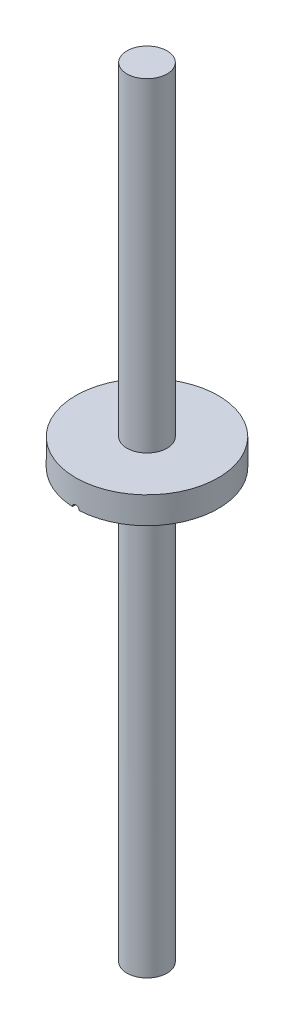
ISO-10303-21;
HEADER;
FILE_DESCRIPTION(('STEP AP214'),'2;1');
FILE_NAME('part.step','',(''),(''),'','','');
FILE_SCHEMA(('AUTOMOTIVE_DESIGN { 1 0 10303 214 1 1 1 1 }'));
ENDSEC;
DATA;
#1=APPLICATION_CONTEXT('core data for automotive mechanical design processes');
#2=APPLICATION_PROTOCOL_DEFINITION('international standard','automotive_design',2000,#1);
#3=PRODUCT_CONTEXT('',#1,'mechanical');
#4=PRODUCT('Part','Part','',(#3));
#5=PRODUCT_RELATED_PRODUCT_CATEGORY('part','',(#4));
#6=PRODUCT_DEFINITION_FORMATION('','',#4);
#7=PRODUCT_DEFINITION_CONTEXT('part definition',#1,'design');
#8=PRODUCT_DEFINITION('design','',#6,#7);
#9=PRODUCT_DEFINITION_SHAPE('','',#8);
#10=(LENGTH_UNIT() NAMED_UNIT(*) SI_UNIT(.MILLI.,.METRE.));
#11=(NAMED_UNIT(*) PLANE_ANGLE_UNIT() SI_UNIT($,.RADIAN.));
#12=(NAMED_UNIT(*) SI_UNIT($,.STERADIAN.) SOLID_ANGLE_UNIT());
#13=UNCERTAINTY_MEASURE_WITH_UNIT(LENGTH_MEASURE(1.E-05),#10,'distance_accuracy_value','');
#14=(GEOMETRIC_REPRESENTATION_CONTEXT(3) GLOBAL_UNCERTAINTY_ASSIGNED_CONTEXT((#13)) GLOBAL_UNIT_ASSIGNED_CONTEXT((#10,
#11,#12)) REPRESENTATION_CONTEXT('',''));
#15=CARTESIAN_POINT('',(0.,0.,0.));
#16=DIRECTION('',(0.,0.,1.));
#17=DIRECTION('',(1.,0.,0.));
#18=AXIS2_PLACEMENT_3D('',#15,#16,#17);
#19=CARTESIAN_POINT('',(0.,0.,-16.9291));
#20=DIRECTION('',(0.,0.,1.));
#21=DIRECTION('',(1.,0.,0.));
#22=AXIS2_PLACEMENT_3D('',#19,#20,#21);
#23=CYLINDRICAL_SURFACE('',#22,0.809435985127344);
#24=DIRECTION('',(0.,0.,1.));
#25=VECTOR('',#24,1.);
#26=CARTESIAN_POINT('',(-0.809435985127344,0.,-16.9291));
#27=LINE('',#26,#25);
#28=CARTESIAN_POINT('',(-0.809435985127344,0.,4.69320995012805));
#29=VERTEX_POINT('',#28);
#30=CARTESIAN_POINT('',(-0.809435985127344,0.,16.909738028603));
#31=VERTEX_POINT('',#30);
#32=EDGE_CURVE('E97',#29,#31,#27,.T.);
#33=ORIENTED_EDGE('',*,*,#32,.F.);
#34=CARTESIAN_POINT('',(-0.809435985127344,0.,4.69320995012805));
#35=CARTESIAN_POINT('',(-0.809476199667795,0.0451886039615407,4.69318442391153));
#36=CARTESIAN_POINT('',(-0.805654434310511,0.090358155944355,4.69386191093371));
#37=CARTESIAN_POINT('',(-0.790592699225558,0.17934834361596,4.69643201236968));
#38=CARTESIAN_POINT('',(-0.779362637061463,0.223170699183958,4.6983230037988));
#39=CARTESIAN_POINT('',(-0.749785477674711,0.30829190671508,4.70313066237056));
#40=CARTESIAN_POINT('',(-0.73143688737471,0.34959022716898,4.70604754467692));
#41=CARTESIAN_POINT('',(-0.688169649011191,0.428525277070468,4.71256924963715));
#42=CARTESIAN_POINT('',(-0.663250861195903,0.466161928608998,4.71617408692375));
#43=CARTESIAN_POINT('',(-0.607279057596034,0.537082982800621,4.72370826040872));
#44=CARTESIAN_POINT('',(-0.576172508414741,0.570324862321658,4.72764024079305));
#45=CARTESIAN_POINT('',(-0.508821194606681,0.631147201659352,4.73536211912557));
#46=CARTESIAN_POINT('',(-0.472575643115268,0.65872679290172,4.73915199520271));
#47=CARTESIAN_POINT('',(-0.395698450343435,0.707599167734623,4.7461906515197));
#48=CARTESIAN_POINT('',(-0.355041017431229,0.728851927853129,4.74943593260395));
#49=CARTESIAN_POINT('',(-0.270671123097469,0.76420894611553,4.75498984270752));
#50=CARTESIAN_POINT('',(-0.226959041827294,0.778314091984511,4.75729858803635));
#51=CARTESIAN_POINT('',(-0.138162686574374,0.798845624684551,4.76070074601862));
#52=CARTESIAN_POINT('',(-0.0930955586469425,0.80534424165717,4.76180558368754));
#53=CARTESIAN_POINT('',(-0.00249689816559721,0.810702953910278,4.76271472351319));
#54=CARTESIAN_POINT('',(0.0430346125127697,0.809563407355333,4.76251908665107));
#55=CARTESIAN_POINT('',(0.132773143179356,0.799734048602368,4.76085829886309));
#56=CARTESIAN_POINT('',(0.176988977692657,0.791122178156821,4.75940625361978));
#57=CARTESIAN_POINT('',(0.263338441302341,0.766715496367719,4.75541044268863));
#58=CARTESIAN_POINT('',(0.305472018440483,0.750920505885128,4.7528666497739));
#59=CARTESIAN_POINT('',(0.386692881165548,0.712518681408115,4.74695086459285));
#60=CARTESIAN_POINT('',(0.425764699409882,0.689879757054088,4.74357498485406));
#61=CARTESIAN_POINT('',(0.499582738294861,0.638457013360215,4.73637001081164));
#62=CARTESIAN_POINT('',(0.534328753942179,0.609672902984518,4.7325408950466));
#63=CARTESIAN_POINT('',(0.598966989685694,0.546349384519993,4.72479836996161));
#64=CARTESIAN_POINT('',(0.628793142548968,0.511742562892024,4.72088450520321));
#65=CARTESIAN_POINT('',(0.682234669740393,0.437969251974499,4.71345866625744));
#66=CARTESIAN_POINT('',(0.705848278931311,0.398801471354003,4.70994680644937));
#67=CARTESIAN_POINT('',(0.746208482314596,0.316934254585122,4.70372177543308));
#68=CARTESIAN_POINT('',(0.762942865914274,0.274228698903827,4.70101002680508));
#69=CARTESIAN_POINT('',(0.788958179494044,0.18658538267188,4.69671460052419));
#70=CARTESIAN_POINT('',(0.798250247701293,0.141651065144823,4.69512923751689));
#71=CARTESIAN_POINT('',(0.805603875585763,0.0803111564261033,4.69386946402682));
#72=CARTESIAN_POINT('',(0.807041507725225,0.0642694026156519,4.69362237170488));
#73=CARTESIAN_POINT('',(0.808956315676491,0.0321541114002843,4.69329277857296));
#74=CARTESIAN_POINT('',(0.809435106587897,0.0160806731698689,4.69321000098861));
#75=CARTESIAN_POINT('',(0.809435985127344,0.,4.69320995012806));
#76=B_SPLINE_CURVE_WITH_KNOTS('',3,(#34,#35,#36,#37,#38,#39,#40,#41,#42,#43,#44,#45,#46,#47,#48,
#49,#50,#51,#52,#53,#54,#55,#56,#57,#58,#59,#60,#61,#62,#63,#64,#65,#66,#67,#68,#69,#70,#71,#72,
#73,#74,#75),.UNSPECIFIED.,.F.,.F.,(4,2,2,2,2,2,2,2,2,2,2,2,2,2,2,2,2,2,2,2,4),(0.,
0.135370800062319,0.27056092658547,0.405779423936584,0.541000797692662,0.677447341702159,
0.813914800499307,0.951228050895773,1.08852424296939,1.22450583897096,1.36048105864287,
1.49505477982943,1.62963185731919,1.76485000375014,1.90007455553018,2.03698860420755,
2.17394151164249,2.31113647099546,2.44812571761251,2.49642738729272,2.54464762759385),.UNSPECIFIED.);
#77=CARTESIAN_POINT('',(0.809435985127344,0.,4.69320995012805));
#78=VERTEX_POINT('',#77);
#79=EDGE_CURVE('E36',#29,#78,#76,.T.);
#80=ORIENTED_EDGE('',*,*,#79,.T.);
#81=DIRECTION('',(0.,0.,1.));
#82=VECTOR('',#81,1.);
#83=CARTESIAN_POINT('',(0.809435985127344,0.,-16.9291));
#84=LINE('',#83,#82);
#85=CARTESIAN_POINT('',(0.809435985127344,0.,16.909738028603));
#86=VERTEX_POINT('',#85);
#87=EDGE_CURVE('E89',#86,#78,#84,.F.);
#88=ORIENTED_EDGE('',*,*,#87,.F.);
#89=CARTESIAN_POINT('',(-0.809435985127344,0.,16.909738028603));
#90=CARTESIAN_POINT('',(-0.809474778022366,0.0455088729988377,16.9097309384024));
#91=CARTESIAN_POINT('',(-0.805600353984008,0.0910056111249262,16.9099215465583));
#92=CARTESIAN_POINT('',(-0.790311686843512,0.180676633185887,16.9106457450332));
#93=CARTESIAN_POINT('',(-0.778903321858,0.224851920075879,16.9111790679513));
#94=CARTESIAN_POINT('',(-0.748825889472059,0.31067577981527,16.9125367344852));
#95=CARTESIAN_POINT('',(-0.730153598648483,0.352323221415517,16.9133612072859));
#96=CARTESIAN_POINT('',(-0.686095964033201,0.431885700206328,16.9152057805544));
#97=CARTESIAN_POINT('',(-0.660711822235338,0.469801404029576,16.9162258459853));
#98=CARTESIAN_POINT('',(-0.603923974471124,0.540863109690026,16.9183482393655));
#99=CARTESIAN_POINT('',(-0.572515862866209,0.574005589368892,16.9194506271586));
#100=CARTESIAN_POINT('',(-0.504576983780455,0.634554486012884,16.9216128643924));
#101=CARTESIAN_POINT('',(-0.468045437304439,0.661960029120256,16.9226727073326));
#102=CARTESIAN_POINT('',(-0.390880064886307,0.710262051357795,16.9246307926498));
#103=CARTESIAN_POINT('',(-0.350244456930593,0.731155686741764,16.9255289643528));
#104=CARTESIAN_POINT('',(-0.266039709810849,0.765821361149498,16.927061794209));
#105=CARTESIAN_POINT('',(-0.222470772274368,0.779593889091363,16.9276964704525));
#106=CARTESIAN_POINT('',(-0.133668626826402,0.799618315035368,16.9286304415317));
#107=CARTESIAN_POINT('',(-0.0884366980205497,0.805875873491462,16.9289299887828));
#108=CARTESIAN_POINT('',(0.0024376197983899,0.810710225242927,16.9291607931639));
#109=CARTESIAN_POINT('',(0.0480800159264558,0.809286885141577,16.9290920438975));
#110=CARTESIAN_POINT('',(0.138438782939152,0.798804279911966,16.9285942027739));
#111=CARTESIAN_POINT('',(0.183155888965415,0.789751335471174,16.9281654091939));
#112=CARTESIAN_POINT('',(0.270434777028743,0.764276323162763,16.9269961285677));
#113=CARTESIAN_POINT('',(0.31299656009514,0.747854258814502,16.9262556416704));
#114=CARTESIAN_POINT('',(0.394778025352342,0.708099584098794,16.9245458610746));
#115=CARTESIAN_POINT('',(0.433996233767999,0.684763946451258,16.9235764671813));
#116=CARTESIAN_POINT('',(0.507959069430553,0.631847865306224,16.9215181175331));
#117=CARTESIAN_POINT('',(0.542703882022046,0.602267680670923,16.9204291667351));
#118=CARTESIAN_POINT('',(0.606767991432896,0.537671295803668,16.9182531607018));
#119=CARTESIAN_POINT('',(0.636082555025772,0.502650401653,16.9171661079307));
#120=CARTESIAN_POINT('',(0.688426333376599,0.428167873009855,16.9151170465687));
#121=CARTESIAN_POINT('',(0.711453568860653,0.388704845626295,16.9141550774043));
#122=CARTESIAN_POINT('',(0.750567525281861,0.306450373876696,16.9124646408362));
#123=CARTESIAN_POINT('',(0.766649840707024,0.263656837052398,16.9117363217235));
#124=CARTESIAN_POINT('',(0.791375570815476,0.176005862072571,16.9105974841258));
#125=CARTESIAN_POINT('',(0.800030320889909,0.131151679342874,16.9101864814729));
#126=CARTESIAN_POINT('',(0.806386175114612,0.071663179217261,16.9098837621373));
#127=CARTESIAN_POINT('',(0.80753045057474,0.057341864887938,16.9098291412776));
#128=CARTESIAN_POINT('',(0.809054313540363,0.0286823130751071,16.9097563224948));
#129=CARTESIAN_POINT('',(0.809435166008328,0.0143441430405898,16.9097380643205));
#130=CARTESIAN_POINT('',(0.809435985127344,0.,16.909738028603));
#131=B_SPLINE_CURVE_WITH_KNOTS('',3,(#89,#90,#91,#92,#93,#94,#95,#96,#97,#98,#99,#100,#101,#102,
#103,#104,#105,#106,#107,#108,#109,#110,#111,#112,#113,#114,#115,#116,#117,#118,#119,#120,#121,
#122,#123,#124,#125,#126,#127,#128,#129,#130),.UNSPECIFIED.,.F.,.F.,(4,2,2,2,2,2,2,2,2,2,2,2,2,
2,2,2,2,2,2,2,4),(0.,0.136344104410632,0.272581956174036,0.408880333625479,0.545154318553981,
0.681528350326488,0.817923139680684,0.954377409368687,1.09082230919049,1.22716437087622,
1.36350880046752,1.49974038746329,1.63597190939736,1.77226317208034,1.90854878603809,
2.04495263879943,2.18139938261337,2.31793255476376,2.45425698783642,2.49734386014978,
2.54035927996565),.UNSPECIFIED.);
#132=EDGE_CURVE('E152',#31,#86,#131,.T.);
#133=ORIENTED_EDGE('',*,*,#132,.F.);
#134=EDGE_LOOP('',(#33,#80,#88,#133));
#135=FACE_BOUND('',#134,.T.);
#136=ADVANCED_FACE('F31',(#135),#23,.F.);
#137=CARTESIAN_POINT('',(0.,0.,0.));
#138=DIRECTION('',(0.,1.,0.));
#139=DIRECTION('',(0.,0.,1.));
#140=AXIS2_PLACEMENT_3D('',#137,#138,#139);
#141=PLANE('',#140);
#142=CARTESIAN_POINT('',(-0.809435985127344,0.,-16.909738028603));
#143=VERTEX_POINT('',#142);
#144=CARTESIAN_POINT('',(-0.809435985127344,0.,-4.69320995012805));
#145=VERTEX_POINT('',#144);
#146=EDGE_CURVE('E85',#143,#145,#27,.T.);
#147=ORIENTED_EDGE('',*,*,#146,.T.);
#148=CARTESIAN_POINT('',(0.,0.,0.));
#149=DIRECTION('',(0.,1.,0.));
#150=DIRECTION('',(0.,0.,1.));
#151=AXIS2_PLACEMENT_3D('',#148,#149,#150);
#152=CIRCLE('',#151,4.7625);
#153=EDGE_CURVE('E53',#145,#29,#152,.T.);
#154=ORIENTED_EDGE('',*,*,#153,.T.);
#155=ORIENTED_EDGE('',*,*,#32,.T.);
#156=CARTESIAN_POINT('',(0.,0.,0.));
#157=DIRECTION('',(0.,1.,0.));
#158=DIRECTION('',(0.,0.,1.));
#159=AXIS2_PLACEMENT_3D('',#156,#157,#158);
#160=CIRCLE('',#159,16.9291);
#161=EDGE_CURVE('E103',#143,#31,#160,.T.);
#162=ORIENTED_EDGE('',*,*,#161,.F.);
#163=EDGE_LOOP('',(#147,#154,#155,#162));
#164=FACE_BOUND('',#163,.T.);
#165=ADVANCED_FACE('F126',(#164),#141,.F.);
#166=CARTESIAN_POINT('',(0.,6.35,0.));
#167=DIRECTION('',(0.,-1.,0.));
#168=DIRECTION('',(0.,0.,-1.));
#169=AXIS2_PLACEMENT_3D('',#166,#167,#168);
#170=CYLINDRICAL_SURFACE('',#169,16.9291);
#171=CARTESIAN_POINT('',(0.,6.35,0.));
#172=DIRECTION('',(0.,1.,0.));
#173=DIRECTION('',(0.,0.,1.));
#174=AXIS2_PLACEMENT_3D('',#171,#172,#173);
#175=CIRCLE('',#174,16.9291);
#176=CARTESIAN_POINT('',(0.,6.35,16.9291));
#177=VERTEX_POINT('',#176);
#178=EDGE_CURVE('E95',#177,#177,#175,.T.);
#179=ORIENTED_EDGE('',*,*,#178,.F.);
#180=EDGE_LOOP('',(#179));
#181=FACE_BOUND('',#180,.T.);
#182=CARTESIAN_POINT('',(0.809435985127344,0.,-16.909738028603));
#183=VERTEX_POINT('',#182);
#184=EDGE_CURVE('E99',#86,#183,#160,.T.);
#185=ORIENTED_EDGE('',*,*,#184,.T.);
#186=CARTESIAN_POINT('',(0.809435985127344,0.,-16.909738028603));
#187=CARTESIAN_POINT('',(0.809474778022366,0.0455088729988377,-16.9097309384024));
#188=CARTESIAN_POINT('',(0.805600353984008,0.0910056111249262,-16.9099215465583));
#189=CARTESIAN_POINT('',(0.790311686843512,0.180676633185887,-16.9106457450332));
#190=CARTESIAN_POINT('',(0.778903321858,0.224851920075879,-16.9111790679513));
#191=CARTESIAN_POINT('',(0.748825889472059,0.31067577981527,-16.9125367344852));
#192=CARTESIAN_POINT('',(0.730153598648483,0.352323221415517,-16.9133612072859));
#193=CARTESIAN_POINT('',(0.686095964033201,0.431885700206328,-16.9152057805544));
#194=CARTESIAN_POINT('',(0.660711822235338,0.469801404029576,-16.9162258459853));
#195=CARTESIAN_POINT('',(0.603923974471124,0.540863109690026,-16.9183482393655));
#196=CARTESIAN_POINT('',(0.572515862866209,0.574005589368892,-16.9194506271586));
#197=CARTESIAN_POINT('',(0.504576983780455,0.634554486012884,-16.9216128643924));
#198=CARTESIAN_POINT('',(0.468045437304439,0.661960029120256,-16.9226727073326));
#199=CARTESIAN_POINT('',(0.390880064886307,0.710262051357795,-16.9246307926498));
#200=CARTESIAN_POINT('',(0.350244456930593,0.731155686741764,-16.9255289643528));
#201=CARTESIAN_POINT('',(0.266039709810849,0.765821361149498,-16.927061794209));
#202=CARTESIAN_POINT('',(0.222470772274368,0.779593889091363,-16.9276964704525));
#203=CARTESIAN_POINT('',(0.133668626826402,0.799618315035368,-16.9286304415317));
#204=CARTESIAN_POINT('',(0.0884366980205497,0.805875873491462,-16.9289299887828));
#205=CARTESIAN_POINT('',(-0.0024376197983899,0.810710225242927,-16.9291607931639));
#206=CARTESIAN_POINT('',(-0.0480800159264558,0.809286885141577,-16.9290920438975));
#207=CARTESIAN_POINT('',(-0.138438782939152,0.798804279911966,-16.9285942027739));
#208=CARTESIAN_POINT('',(-0.183155888965415,0.789751335471174,-16.9281654091939));
#209=CARTESIAN_POINT('',(-0.270434777028743,0.764276323162763,-16.9269961285677));
#210=CARTESIAN_POINT('',(-0.31299656009514,0.747854258814502,-16.9262556416704));
#211=CARTESIAN_POINT('',(-0.394778025352342,0.708099584098794,-16.9245458610746));
#212=CARTESIAN_POINT('',(-0.433996233767999,0.684763946451258,-16.9235764671813));
#213=CARTESIAN_POINT('',(-0.507959069430553,0.631847865306224,-16.9215181175331));
#214=CARTESIAN_POINT('',(-0.542703882022046,0.602267680670923,-16.9204291667351));
#215=CARTESIAN_POINT('',(-0.606767991432896,0.537671295803668,-16.9182531607018));
#216=CARTESIAN_POINT('',(-0.636082555025772,0.502650401653,-16.9171661079307));
#217=CARTESIAN_POINT('',(-0.688426333376599,0.428167873009855,-16.9151170465687));
#218=CARTESIAN_POINT('',(-0.711453568860653,0.388704845626295,-16.9141550774043));
#219=CARTESIAN_POINT('',(-0.750567525281861,0.306450373876696,-16.9124646408362));
#220=CARTESIAN_POINT('',(-0.766649840707024,0.263656837052398,-16.9117363217235));
#221=CARTESIAN_POINT('',(-0.791375570815476,0.176005862072571,-16.9105974841258));
#222=CARTESIAN_POINT('',(-0.800030320889909,0.131151679342874,-16.9101864814729));
#223=CARTESIAN_POINT('',(-0.806386175114612,0.071663179217261,-16.9098837621373));
#224=CARTESIAN_POINT('',(-0.80753045057474,0.057341864887938,-16.9098291412776));
#225=CARTESIAN_POINT('',(-0.809054313540363,0.0286823130751071,-16.9097563224948));
#226=CARTESIAN_POINT('',(-0.809435166008328,0.0143441430405898,-16.9097380643205));
#227=CARTESIAN_POINT('',(-0.809435985127344,0.,-16.909738028603));
#228=B_SPLINE_CURVE_WITH_KNOTS('',3,(#186,#187,#188,#189,#190,#191,#192,#193,#194,#195,#196,
#197,#198,#199,#200,#201,#202,#203,#204,#205,#206,#207,#208,#209,#210,#211,#212,#213,#214,#215,
#216,#217,#218,#219,#220,#221,#222,#223,#224,#225,#226,#227),.UNSPECIFIED.,.F.,.F.,(4,2,2,2,2,2,
2,2,2,2,2,2,2,2,2,2,2,2,2,2,4),(0.,0.136344104410632,0.272581956174036,0.408880333625479,
0.545154318553981,0.681528350326488,0.817923139680684,0.954377409368687,1.09082230919049,
1.22716437087622,1.36350880046752,1.49974038746329,1.63597190939736,1.77226317208034,
1.90854878603809,2.04495263879943,2.18139938261337,2.31793255476376,2.45425698783642,
2.49734386014978,2.54035927996565),.UNSPECIFIED.);
#229=EDGE_CURVE('E93',#183,#143,#228,.T.);
#230=ORIENTED_EDGE('',*,*,#229,.T.);
#231=ORIENTED_EDGE('',*,*,#161,.T.);
#232=ORIENTED_EDGE('',*,*,#132,.T.);
#233=EDGE_LOOP('',(#185,#230,#231,#232));
#234=FACE_BOUND('',#233,.T.);
#235=ADVANCED_FACE('F33',(#181,#234),#170,.T.);
#236=CARTESIAN_POINT('',(0.,6.35,0.));
#237=DIRECTION('',(0.,1.,0.));
#238=DIRECTION('',(0.,0.,1.));
#239=AXIS2_PLACEMENT_3D('',#236,#237,#238);
#240=PLANE('',#239);
#241=CARTESIAN_POINT('',(0.,6.34999999999999,0.));
#242=DIRECTION('',(0.,1.,0.));
#243=DIRECTION('',(0.,0.,1.));
#244=AXIS2_PLACEMENT_3D('',#241,#242,#243);
#245=CIRCLE('',#244,4.7625);
#246=CARTESIAN_POINT('',(0.,6.34999999999999,4.7625));
#247=VERTEX_POINT('',#246);
#248=EDGE_CURVE('E11',#247,#247,#245,.T.);
#249=ORIENTED_EDGE('',*,*,#248,.F.);
#250=EDGE_LOOP('',(#249));
#251=FACE_BOUND('',#250,.T.);
#252=ORIENTED_EDGE('',*,*,#178,.T.);
#253=EDGE_LOOP('',(#252));
#254=FACE_BOUND('',#253,.T.);
#255=ADVANCED_FACE('F137',(#251,#254),#240,.T.);
#256=ORIENTED_EDGE('',*,*,#87,.T.);
#257=CARTESIAN_POINT('',(0.,0.,0.));
#258=DIRECTION('',(0.,1.,0.));
#259=DIRECTION('',(0.,0.,1.));
#260=AXIS2_PLACEMENT_3D('',#257,#258,#259);
#261=CIRCLE('',#260,4.7625);
#262=CARTESIAN_POINT('',(0.809435985127344,0.,-4.69320995012805));
#263=VERTEX_POINT('',#262);
#264=EDGE_CURVE('E80',#78,#263,#261,.T.);
#265=ORIENTED_EDGE('',*,*,#264,.T.);
#266=EDGE_CURVE('E61',#263,#183,#84,.F.);
#267=ORIENTED_EDGE('',*,*,#266,.T.);
#268=ORIENTED_EDGE('',*,*,#184,.F.);
#269=EDGE_LOOP('',(#256,#265,#267,#268));
#270=FACE_BOUND('',#269,.T.);
#271=ADVANCED_FACE('F87',(#270),#141,.F.);
#272=ORIENTED_EDGE('',*,*,#266,.F.);
#273=CARTESIAN_POINT('',(0.809435985127344,0.,-4.69320995012805));
#274=CARTESIAN_POINT('',(0.809476199667795,0.0451886039615405,-4.69318442391153));
#275=CARTESIAN_POINT('',(0.805654434310511,0.0903581559443549,-4.69386191093371));
#276=CARTESIAN_POINT('',(0.790592699225558,0.17934834361596,-4.69643201236968));
#277=CARTESIAN_POINT('',(0.779362637061463,0.223170699183958,-4.6983230037988));
#278=CARTESIAN_POINT('',(0.749785477674711,0.30829190671508,-4.70313066237056));
#279=CARTESIAN_POINT('',(0.73143688737471,0.34959022716898,-4.70604754467692));
#280=CARTESIAN_POINT('',(0.688169649011191,0.428525277070467,-4.71256924963715));
#281=CARTESIAN_POINT('',(0.663250861195903,0.466161928608998,-4.71617408692375));
#282=CARTESIAN_POINT('',(0.607279057596034,0.537082982800621,-4.72370826040872));
#283=CARTESIAN_POINT('',(0.576172508414741,0.570324862321658,-4.72764024079305));
#284=CARTESIAN_POINT('',(0.508821194606681,0.631147201659352,-4.73536211912557));
#285=CARTESIAN_POINT('',(0.472575643115268,0.65872679290172,-4.73915199520271));
#286=CARTESIAN_POINT('',(0.395698450343435,0.707599167734623,-4.7461906515197));
#287=CARTESIAN_POINT('',(0.355041017431229,0.728851927853129,-4.74943593260395));
#288=CARTESIAN_POINT('',(0.270671123097469,0.76420894611553,-4.75498984270752));
#289=CARTESIAN_POINT('',(0.226959041827294,0.778314091984511,-4.75729858803635));
#290=CARTESIAN_POINT('',(0.138162686574374,0.798845624684551,-4.76070074601862));
#291=CARTESIAN_POINT('',(0.0930955586469425,0.80534424165717,-4.76180558368754));
#292=CARTESIAN_POINT('',(0.00249689816559725,0.810702953910278,-4.76271472351319));
#293=CARTESIAN_POINT('',(-0.0430346125127697,0.809563407355333,-4.76251908665107));
#294=CARTESIAN_POINT('',(-0.132773143179356,0.799734048602368,-4.76085829886309));
#295=CARTESIAN_POINT('',(-0.176988977692657,0.791122178156821,-4.75940625361978));
#296=CARTESIAN_POINT('',(-0.263338441302341,0.766715496367719,-4.75541044268863));
#297=CARTESIAN_POINT('',(-0.305472018440483,0.750920505885128,-4.7528666497739));
#298=CARTESIAN_POINT('',(-0.386692881165548,0.712518681408115,-4.74695086459285));
#299=CARTESIAN_POINT('',(-0.425764699409882,0.689879757054088,-4.74357498485406));
#300=CARTESIAN_POINT('',(-0.499582738294861,0.638457013360215,-4.73637001081164));
#301=CARTESIAN_POINT('',(-0.534328753942178,0.609672902984518,-4.7325408950466));
#302=CARTESIAN_POINT('',(-0.598966989685694,0.546349384519993,-4.72479836996161));
#303=CARTESIAN_POINT('',(-0.628793142548967,0.511742562892024,-4.72088450520321));
#304=CARTESIAN_POINT('',(-0.682234669740393,0.437969251974499,-4.71345866625744));
#305=CARTESIAN_POINT('',(-0.705848278931311,0.398801471354003,-4.70994680644937));
#306=CARTESIAN_POINT('',(-0.746208482314596,0.316934254585122,-4.70372177543308));
#307=CARTESIAN_POINT('',(-0.762942865914274,0.274228698903827,-4.70101002680508));
#308=CARTESIAN_POINT('',(-0.788958179494044,0.18658538267188,-4.69671460052419));
#309=CARTESIAN_POINT('',(-0.798250247701293,0.141651065144823,-4.69512923751689));
#310=CARTESIAN_POINT('',(-0.805603875585763,0.0803111564261034,-4.69386946402682));
#311=CARTESIAN_POINT('',(-0.807041507725225,0.064269402615652,-4.69362237170488));
#312=CARTESIAN_POINT('',(-0.808956315676491,0.0321541114002844,-4.69329277857296));
#313=CARTESIAN_POINT('',(-0.809435106587897,0.016080673169869,-4.69321000098861));
#314=CARTESIAN_POINT('',(-0.809435985127344,0.,-4.69320995012806));
#315=B_SPLINE_CURVE_WITH_KNOTS('',3,(#273,#274,#275,#276,#277,#278,#279,#280,#281,#282,#283,
#284,#285,#286,#287,#288,#289,#290,#291,#292,#293,#294,#295,#296,#297,#298,#299,#300,#301,#302,
#303,#304,#305,#306,#307,#308,#309,#310,#311,#312,#313,#314),.UNSPECIFIED.,.F.,.F.,(4,2,2,2,2,2,
2,2,2,2,2,2,2,2,2,2,2,2,2,2,4),(0.,0.135370800062319,0.27056092658547,0.405779423936584,
0.541000797692662,0.67744734170216,0.813914800499307,0.951228050895773,1.08852424296939,
1.22450583897096,1.36048105864287,1.49505477982943,1.62963185731919,1.76485000375014,
1.90007455553018,2.03698860420755,2.17394151164249,2.31113647099546,2.44812571761251,
2.49642738729272,2.54464762759385),.UNSPECIFIED.);
#316=EDGE_CURVE('E78',#263,#145,#315,.T.);
#317=ORIENTED_EDGE('',*,*,#316,.T.);
#318=ORIENTED_EDGE('',*,*,#146,.F.);
#319=ORIENTED_EDGE('',*,*,#229,.F.);
#320=EDGE_LOOP('',(#272,#317,#318,#319));
#321=FACE_BOUND('',#320,.T.);
#322=ADVANCED_FACE('F92',(#321),#23,.F.);
#323=CARTESIAN_POINT('',(0.,-101.65,0.));
#324=DIRECTION('',(0.,1.,0.));
#325=DIRECTION('',(0.,0.,1.));
#326=AXIS2_PLACEMENT_3D('',#323,#324,#325);
#327=PLANE('',#326);
#328=CARTESIAN_POINT('',(0.,-101.65,0.));
#329=DIRECTION('',(0.,1.,0.));
#330=DIRECTION('',(0.,0.,1.));
#331=AXIS2_PLACEMENT_3D('',#328,#329,#330);
#332=CIRCLE('',#331,4.7625);
#333=CARTESIAN_POINT('',(0.,-101.65,4.7625));
#334=VERTEX_POINT('',#333);
#335=EDGE_CURVE('E90',#334,#334,#332,.T.);
#336=ORIENTED_EDGE('',*,*,#335,.F.);
#337=EDGE_LOOP('',(#336));
#338=FACE_BOUND('',#337,.T.);
#339=ADVANCED_FACE('F115',(#338),#327,.F.);
#340=CARTESIAN_POINT('',(0.,-101.65,0.));
#341=DIRECTION('',(0.,1.,0.));
#342=DIRECTION('',(0.,0.,1.));
#343=AXIS2_PLACEMENT_3D('',#340,#341,#342);
#344=CYLINDRICAL_SURFACE('',#343,4.7625);
#345=ORIENTED_EDGE('',*,*,#335,.T.);
#346=EDGE_LOOP('',(#345));
#347=FACE_BOUND('',#346,.T.);
#348=ORIENTED_EDGE('',*,*,#79,.F.);
#349=ORIENTED_EDGE('',*,*,#153,.F.);
#350=ORIENTED_EDGE('',*,*,#316,.F.);
#351=ORIENTED_EDGE('',*,*,#264,.F.);
#352=EDGE_LOOP('',(#348,#349,#350,#351));
#353=FACE_BOUND('',#352,.T.);
#354=ADVANCED_FACE('F79',(#347,#353),#344,.T.);
#355=ORIENTED_EDGE('',*,*,#248,.T.);
#356=EDGE_LOOP('',(#355));
#357=FACE_BOUND('',#356,.T.);
#358=CARTESIAN_POINT('',(0.,83.35,0.));
#359=DIRECTION('',(0.,1.,0.));
#360=DIRECTION('',(0.,0.,1.));
#361=AXIS2_PLACEMENT_3D('',#358,#359,#360);
#362=CIRCLE('',#361,4.7625);
#363=CARTESIAN_POINT('',(0.,83.35,4.7625));
#364=VERTEX_POINT('',#363);
#365=EDGE_CURVE('E166',#364,#364,#362,.T.);
#366=ORIENTED_EDGE('',*,*,#365,.F.);
#367=EDGE_LOOP('',(#366));
#368=FACE_BOUND('',#367,.T.);
#369=ADVANCED_FACE('F109',(#357,#368),#344,.T.);
#370=CARTESIAN_POINT('',(0.,83.35,0.));
#371=DIRECTION('',(0.,1.,0.));
#372=DIRECTION('',(0.,0.,1.));
#373=AXIS2_PLACEMENT_3D('',#370,#371,#372);
#374=PLANE('',#373);
#375=ORIENTED_EDGE('',*,*,#365,.T.);
#376=EDGE_LOOP('',(#375));
#377=FACE_BOUND('',#376,.T.);
#378=ADVANCED_FACE('F113',(#377),#374,.T.);
#379=CLOSED_SHELL('',(#136,#165,#235,#255,#271,#322,#339,#354,#369,#378));
#380=MANIFOLD_SOLID_BREP('B2',#379);
#381=ADVANCED_BREP_SHAPE_REPRESENTATION('',(#18,#380),#14);
#382=SHAPE_DEFINITION_REPRESENTATION(#9,#381);
ENDSEC;
END-ISO-10303-21;
